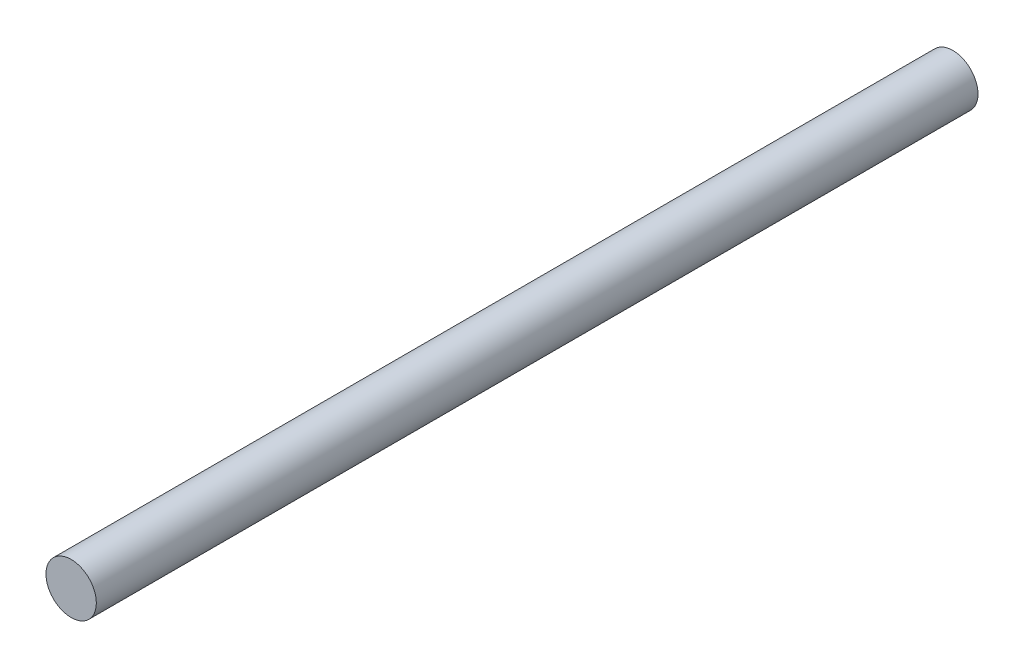
ISO-10303-21;
HEADER;
FILE_DESCRIPTION(('STEP AP214'),'2;1');
FILE_NAME('part.step','',(''),(''),'','','');
FILE_SCHEMA(('AUTOMOTIVE_DESIGN { 1 0 10303 214 1 1 1 1 }'));
ENDSEC;
DATA;
#1=APPLICATION_CONTEXT('core data for automotive mechanical design processes');
#2=APPLICATION_PROTOCOL_DEFINITION('international standard','automotive_design',2000,#1);
#3=PRODUCT_CONTEXT('',#1,'mechanical');
#4=PRODUCT('Part','Part','',(#3));
#5=PRODUCT_RELATED_PRODUCT_CATEGORY('part','',(#4));
#6=PRODUCT_DEFINITION_FORMATION('','',#4);
#7=PRODUCT_DEFINITION_CONTEXT('part definition',#1,'design');
#8=PRODUCT_DEFINITION('design','',#6,#7);
#9=PRODUCT_DEFINITION_SHAPE('','',#8);
#10=(LENGTH_UNIT() NAMED_UNIT(*) SI_UNIT(.MILLI.,.METRE.));
#11=(NAMED_UNIT(*) PLANE_ANGLE_UNIT() SI_UNIT($,.RADIAN.));
#12=(NAMED_UNIT(*) SI_UNIT($,.STERADIAN.) SOLID_ANGLE_UNIT());
#13=UNCERTAINTY_MEASURE_WITH_UNIT(LENGTH_MEASURE(1.E-05),#10,'distance_accuracy_value','');
#14=(GEOMETRIC_REPRESENTATION_CONTEXT(3) GLOBAL_UNCERTAINTY_ASSIGNED_CONTEXT((#13)) GLOBAL_UNIT_ASSIGNED_CONTEXT((#10,
#11,#12)) REPRESENTATION_CONTEXT('',''));
#15=CARTESIAN_POINT('',(0.,0.,0.));
#16=DIRECTION('',(0.,0.,1.));
#17=DIRECTION('',(1.,0.,0.));
#18=AXIS2_PLACEMENT_3D('',#15,#16,#17);
#19=CARTESIAN_POINT('',(0.,0.,350.));
#20=DIRECTION('',(0.,0.,-1.));
#21=DIRECTION('',(-1.,0.,0.));
#22=AXIS2_PLACEMENT_3D('',#19,#20,#21);
#23=CYLINDRICAL_SURFACE('',#22,10.);
#24=CARTESIAN_POINT('',(0.,0.,350.));
#25=DIRECTION('',(0.,0.,1.));
#26=DIRECTION('',(1.,0.,0.));
#27=AXIS2_PLACEMENT_3D('',#24,#25,#26);
#28=CIRCLE('',#27,10.);
#29=CARTESIAN_POINT('',(10.,0.,350.));
#30=VERTEX_POINT('',#29);
#31=EDGE_CURVE('E10',#30,#30,#28,.T.);
#32=ORIENTED_EDGE('',*,*,#31,.F.);
#33=EDGE_LOOP('',(#32));
#34=FACE_BOUND('',#33,.T.);
#35=CARTESIAN_POINT('',(0.,0.,0.));
#36=DIRECTION('',(0.,0.,1.));
#37=DIRECTION('',(1.,0.,0.));
#38=AXIS2_PLACEMENT_3D('',#35,#36,#37);
#39=CIRCLE('',#38,10.);
#40=CARTESIAN_POINT('',(10.,0.,0.));
#41=VERTEX_POINT('',#40);
#42=EDGE_CURVE('E40',#41,#41,#39,.T.);
#43=ORIENTED_EDGE('',*,*,#42,.T.);
#44=EDGE_LOOP('',(#43));
#45=FACE_BOUND('',#44,.T.);
#46=ADVANCED_FACE('F37',(#34,#45),#23,.T.);
#47=CARTESIAN_POINT('',(0.,0.,350.));
#48=DIRECTION('',(0.,0.,1.));
#49=DIRECTION('',(1.,0.,0.));
#50=AXIS2_PLACEMENT_3D('',#47,#48,#49);
#51=PLANE('',#50);
#52=ORIENTED_EDGE('',*,*,#31,.T.);
#53=EDGE_LOOP('',(#52));
#54=FACE_BOUND('',#53,.T.);
#55=ADVANCED_FACE('F54',(#54),#51,.T.);
#56=CARTESIAN_POINT('',(0.,0.,0.));
#57=DIRECTION('',(0.,0.,1.));
#58=DIRECTION('',(1.,0.,0.));
#59=AXIS2_PLACEMENT_3D('',#56,#57,#58);
#60=PLANE('',#59);
#61=ORIENTED_EDGE('',*,*,#42,.F.);
#62=EDGE_LOOP('',(#61));
#63=FACE_BOUND('',#62,.T.);
#64=ADVANCED_FACE('F52',(#63),#60,.F.);
#65=CLOSED_SHELL('',(#46,#55,#64));
#66=MANIFOLD_SOLID_BREP('B2',#65);
#67=ADVANCED_BREP_SHAPE_REPRESENTATION('',(#18,#66),#14);
#68=SHAPE_DEFINITION_REPRESENTATION(#9,#67);
ENDSEC;
END-ISO-10303-21;
